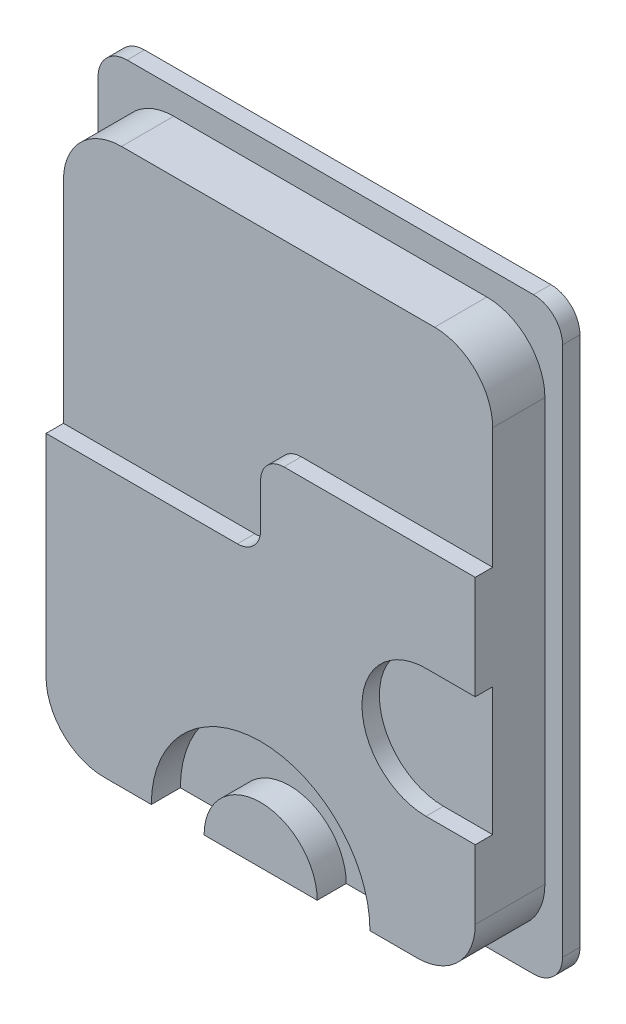
ISO-10303-21;
HEADER;
FILE_DESCRIPTION(('STEP AP214'),'2;1');
FILE_NAME('part.step','',(''),(''),'','','');
FILE_SCHEMA(('AUTOMOTIVE_DESIGN { 1 0 10303 214 1 1 1 1 }'));
ENDSEC;
DATA;
#1=APPLICATION_CONTEXT('core data for automotive mechanical design processes');
#2=APPLICATION_PROTOCOL_DEFINITION('international standard','automotive_design',2000,#1);
#3=PRODUCT_CONTEXT('',#1,'mechanical');
#4=PRODUCT('Part','Part','',(#3));
#5=PRODUCT_RELATED_PRODUCT_CATEGORY('part','',(#4));
#6=PRODUCT_DEFINITION_FORMATION('','',#4);
#7=PRODUCT_DEFINITION_CONTEXT('part definition',#1,'design');
#8=PRODUCT_DEFINITION('design','',#6,#7);
#9=PRODUCT_DEFINITION_SHAPE('','',#8);
#10=(LENGTH_UNIT() NAMED_UNIT(*) SI_UNIT(.MILLI.,.METRE.));
#11=(NAMED_UNIT(*) PLANE_ANGLE_UNIT() SI_UNIT($,.RADIAN.));
#12=(NAMED_UNIT(*) SI_UNIT($,.STERADIAN.) SOLID_ANGLE_UNIT());
#13=UNCERTAINTY_MEASURE_WITH_UNIT(LENGTH_MEASURE(1.E-05),#10,'distance_accuracy_value','');
#14=(GEOMETRIC_REPRESENTATION_CONTEXT(3) GLOBAL_UNCERTAINTY_ASSIGNED_CONTEXT((#13)) GLOBAL_UNIT_ASSIGNED_CONTEXT((#10,
#11,#12)) REPRESENTATION_CONTEXT('',''));
#15=CARTESIAN_POINT('',(0.,0.,0.));
#16=DIRECTION('',(0.,0.,1.));
#17=DIRECTION('',(1.,0.,0.));
#18=AXIS2_PLACEMENT_3D('',#15,#16,#17);
#19=CARTESIAN_POINT('',(5.,5.,15.));
#20=DIRECTION('',(0.,0.,-1.));
#21=DIRECTION('',(-1.,0.,0.));
#22=AXIS2_PLACEMENT_3D('',#19,#20,#21);
#23=PLANE('',#22);
#24=CARTESIAN_POINT('',(40.,4.37176263878269,15.));
#25=DIRECTION('',(0.,0.,1.));
#26=DIRECTION('',(1.,0.,0.));
#27=AXIS2_PLACEMENT_3D('',#24,#25,#26);
#28=CIRCLE('',#27,9.73943655351803);
#29=CARTESIAN_POINT('',(49.739436553518,4.37176263878269,15.));
#30=VERTEX_POINT('',#29);
#31=CARTESIAN_POINT('',(30.260563446482,4.37176263878269,15.));
#32=VERTEX_POINT('',#31);
#33=EDGE_CURVE('E235',#30,#32,#28,.T.);
#34=ORIENTED_EDGE('',*,*,#33,.T.);
#35=DIRECTION('',(1.,0.,0.));
#36=VECTOR('',#35,1.);
#37=CARTESIAN_POINT('',(13.0370379435771,4.37176263878269,15.));
#38=LINE('',#37,#36);
#39=EDGE_CURVE('E366',#32,#30,#38,.T.);
#40=ORIENTED_EDGE('',*,*,#39,.T.);
#41=EDGE_LOOP('',(#34,#40));
#42=FACE_BOUND('',#41,.T.);
#43=ADVANCED_FACE('F34',(#42),#23,.F.);
#44=CARTESIAN_POINT('',(5.,5.,15.));
#45=DIRECTION('',(0.,0.,-1.));
#46=DIRECTION('',(-1.,0.,0.));
#47=AXIS2_PLACEMENT_3D('',#44,#45,#46);
#48=CYLINDRICAL_SURFACE('',#47,5.);
#49=DIRECTION('',(0.,0.,-1.));
#50=VECTOR('',#49,1.);
#51=CARTESIAN_POINT('',(5.00000000000004,0.,15.));
#52=LINE('',#51,#50);
#53=CARTESIAN_POINT('',(5.00000000000004,0.,3.));
#54=VERTEX_POINT('',#53);
#55=CARTESIAN_POINT('',(5.00000000000004,0.,0.));
#56=VERTEX_POINT('',#55);
#57=EDGE_CURVE('E453',#54,#56,#52,.T.);
#58=ORIENTED_EDGE('',*,*,#57,.F.);
#59=CARTESIAN_POINT('',(5.,5.,3.));
#60=DIRECTION('',(0.,0.,-1.));
#61=DIRECTION('',(-1.,0.,0.));
#62=AXIS2_PLACEMENT_3D('',#59,#60,#61);
#63=CIRCLE('',#62,5.);
#64=CARTESIAN_POINT('',(0.,5.00000000000004,3.));
#65=VERTEX_POINT('',#64);
#66=EDGE_CURVE('E412',#54,#65,#63,.T.);
#67=ORIENTED_EDGE('',*,*,#66,.T.);
#68=DIRECTION('',(0.,0.,-1.));
#69=VECTOR('',#68,1.);
#70=CARTESIAN_POINT('',(0.,5.00000000000004,15.));
#71=LINE('',#70,#69);
#72=CARTESIAN_POINT('',(0.,5.00000000000004,0.));
#73=VERTEX_POINT('',#72);
#74=EDGE_CURVE('E439',#65,#73,#71,.T.);
#75=ORIENTED_EDGE('',*,*,#74,.T.);
#76=CARTESIAN_POINT('',(5.,5.,0.));
#77=DIRECTION('',(0.,0.,1.));
#78=DIRECTION('',(-1.,0.,0.));
#79=AXIS2_PLACEMENT_3D('',#76,#77,#78);
#80=CIRCLE('',#79,5.);
#81=EDGE_CURVE('E415',#73,#56,#80,.T.);
#82=ORIENTED_EDGE('',*,*,#81,.T.);
#83=EDGE_LOOP('',(#58,#67,#75,#82));
#84=FACE_BOUND('',#83,.T.);
#85=ADVANCED_FACE('F36',(#84),#48,.T.);
#86=CARTESIAN_POINT('',(5.00000000000004,0.,15.));
#87=DIRECTION('',(0.,1.,0.));
#88=DIRECTION('',(0.,0.,1.));
#89=AXIS2_PLACEMENT_3D('',#86,#87,#88);
#90=PLANE('',#89);
#91=DIRECTION('',(0.,0.,-1.));
#92=VECTOR('',#91,1.);
#93=CARTESIAN_POINT('',(75.,0.,15.));
#94=LINE('',#93,#92);
#95=CARTESIAN_POINT('',(75.,0.,3.));
#96=VERTEX_POINT('',#95);
#97=CARTESIAN_POINT('',(75.,0.,0.));
#98=VERTEX_POINT('',#97);
#99=EDGE_CURVE('E451',#96,#98,#94,.T.);
#100=ORIENTED_EDGE('',*,*,#99,.F.);
#101=DIRECTION('',(-1.,0.,0.));
#102=VECTOR('',#101,1.);
#103=CARTESIAN_POINT('',(5.00000000000004,0.,3.));
#104=LINE('',#103,#102);
#105=EDGE_CURVE('E409',#96,#54,#104,.T.);
#106=ORIENTED_EDGE('',*,*,#105,.T.);
#107=ORIENTED_EDGE('',*,*,#57,.T.);
#108=DIRECTION('',(1.,0.,0.));
#109=VECTOR('',#108,1.);
#110=CARTESIAN_POINT('',(5.00000000000004,0.,0.));
#111=LINE('',#110,#109);
#112=EDGE_CURVE('E418',#56,#98,#111,.T.);
#113=ORIENTED_EDGE('',*,*,#112,.T.);
#114=EDGE_LOOP('',(#100,#106,#107,#113));
#115=FACE_BOUND('',#114,.T.);
#116=ADVANCED_FACE('F554',(#115),#90,.F.);
#117=CARTESIAN_POINT('',(75.,5.,15.));
#118=DIRECTION('',(0.,0.,-1.));
#119=DIRECTION('',(-1.,0.,0.));
#120=AXIS2_PLACEMENT_3D('',#117,#118,#119);
#121=CYLINDRICAL_SURFACE('',#120,5.);
#122=DIRECTION('',(0.,0.,-1.));
#123=VECTOR('',#122,1.);
#124=CARTESIAN_POINT('',(80.,5.,15.));
#125=LINE('',#124,#123);
#126=CARTESIAN_POINT('',(80.,5.,3.));
#127=VERTEX_POINT('',#126);
#128=CARTESIAN_POINT('',(80.,5.,0.));
#129=VERTEX_POINT('',#128);
#130=EDGE_CURVE('E449',#127,#129,#125,.T.);
#131=ORIENTED_EDGE('',*,*,#130,.F.);
#132=CARTESIAN_POINT('',(75.,5.,3.));
#133=DIRECTION('',(0.,0.,-1.));
#134=DIRECTION('',(-1.,0.,0.));
#135=AXIS2_PLACEMENT_3D('',#132,#133,#134);
#136=CIRCLE('',#135,5.);
#137=EDGE_CURVE('E406',#127,#96,#136,.T.);
#138=ORIENTED_EDGE('',*,*,#137,.T.);
#139=ORIENTED_EDGE('',*,*,#99,.T.);
#140=CARTESIAN_POINT('',(75.,5.,0.));
#141=DIRECTION('',(0.,0.,1.));
#142=DIRECTION('',(1.,0.,0.));
#143=AXIS2_PLACEMENT_3D('',#140,#141,#142);
#144=CIRCLE('',#143,5.);
#145=EDGE_CURVE('E421',#98,#129,#144,.T.);
#146=ORIENTED_EDGE('',*,*,#145,.T.);
#147=EDGE_LOOP('',(#131,#138,#139,#146));
#148=FACE_BOUND('',#147,.T.);
#149=ADVANCED_FACE('F601',(#148),#121,.T.);
#150=CARTESIAN_POINT('',(80.,5.00000000000004,15.));
#151=DIRECTION('',(-1.,0.,0.));
#152=DIRECTION('',(0.,0.,1.));
#153=AXIS2_PLACEMENT_3D('',#150,#151,#152);
#154=PLANE('',#153);
#155=DIRECTION('',(0.,0.,-1.));
#156=VECTOR('',#155,1.);
#157=CARTESIAN_POINT('',(80.,96.346,15.));
#158=LINE('',#157,#156);
#159=CARTESIAN_POINT('',(80.,96.346,3.));
#160=VERTEX_POINT('',#159);
#161=CARTESIAN_POINT('',(80.,96.346,0.));
#162=VERTEX_POINT('',#161);
#163=EDGE_CURVE('E447',#160,#162,#158,.T.);
#164=ORIENTED_EDGE('',*,*,#163,.F.);
#165=DIRECTION('',(0.,-1.,0.));
#166=VECTOR('',#165,1.);
#167=CARTESIAN_POINT('',(80.,5.00000000000004,3.));
#168=LINE('',#167,#166);
#169=EDGE_CURVE('E403',#160,#127,#168,.T.);
#170=ORIENTED_EDGE('',*,*,#169,.T.);
#171=ORIENTED_EDGE('',*,*,#130,.T.);
#172=DIRECTION('',(0.,1.,0.));
#173=VECTOR('',#172,1.);
#174=CARTESIAN_POINT('',(80.,5.00000000000004,0.));
#175=LINE('',#174,#173);
#176=EDGE_CURVE('E424',#129,#162,#175,.T.);
#177=ORIENTED_EDGE('',*,*,#176,.T.);
#178=EDGE_LOOP('',(#164,#170,#171,#177));
#179=FACE_BOUND('',#178,.T.);
#180=ADVANCED_FACE('F597',(#179),#154,.F.);
#181=CARTESIAN_POINT('',(75.,96.346,15.));
#182=DIRECTION('',(0.,0.,-1.));
#183=DIRECTION('',(-1.,0.,0.));
#184=AXIS2_PLACEMENT_3D('',#181,#182,#183);
#185=CYLINDRICAL_SURFACE('',#184,5.);
#186=DIRECTION('',(0.,0.,-1.));
#187=VECTOR('',#186,1.);
#188=CARTESIAN_POINT('',(75.,101.346,15.));
#189=LINE('',#188,#187);
#190=CARTESIAN_POINT('',(75.,101.346,3.));
#191=VERTEX_POINT('',#190);
#192=CARTESIAN_POINT('',(75.,101.346,0.));
#193=VERTEX_POINT('',#192);
#194=EDGE_CURVE('E445',#191,#193,#189,.T.);
#195=ORIENTED_EDGE('',*,*,#194,.F.);
#196=CARTESIAN_POINT('',(75.,96.346,3.));
#197=DIRECTION('',(0.,0.,-1.));
#198=DIRECTION('',(-1.,0.,0.));
#199=AXIS2_PLACEMENT_3D('',#196,#197,#198);
#200=CIRCLE('',#199,5.);
#201=EDGE_CURVE('E400',#191,#160,#200,.T.);
#202=ORIENTED_EDGE('',*,*,#201,.T.);
#203=ORIENTED_EDGE('',*,*,#163,.T.);
#204=CARTESIAN_POINT('',(75.,96.346,0.));
#205=DIRECTION('',(0.,0.,1.));
#206=DIRECTION('',(-1.,0.,0.));
#207=AXIS2_PLACEMENT_3D('',#204,#205,#206);
#208=CIRCLE('',#207,5.);
#209=EDGE_CURVE('E427',#162,#193,#208,.T.);
#210=ORIENTED_EDGE('',*,*,#209,.T.);
#211=EDGE_LOOP('',(#195,#202,#203,#210));
#212=FACE_BOUND('',#211,.T.);
#213=ADVANCED_FACE('F593',(#212),#185,.T.);
#214=CARTESIAN_POINT('',(5.00000000000004,101.346,15.));
#215=DIRECTION('',(0.,-1.,0.));
#216=DIRECTION('',(0.,0.,-1.));
#217=AXIS2_PLACEMENT_3D('',#214,#215,#216);
#218=PLANE('',#217);
#219=DIRECTION('',(0.,0.,-1.));
#220=VECTOR('',#219,1.);
#221=CARTESIAN_POINT('',(5.00000000000004,101.346,15.));
#222=LINE('',#221,#220);
#223=CARTESIAN_POINT('',(5.00000000000004,101.346,3.));
#224=VERTEX_POINT('',#223);
#225=CARTESIAN_POINT('',(5.00000000000004,101.346,0.));
#226=VERTEX_POINT('',#225);
#227=EDGE_CURVE('E443',#224,#226,#222,.T.);
#228=ORIENTED_EDGE('',*,*,#227,.F.);
#229=DIRECTION('',(1.,0.,0.));
#230=VECTOR('',#229,1.);
#231=CARTESIAN_POINT('',(5.00000000000004,101.346,3.));
#232=LINE('',#231,#230);
#233=EDGE_CURVE('E397',#224,#191,#232,.T.);
#234=ORIENTED_EDGE('',*,*,#233,.T.);
#235=ORIENTED_EDGE('',*,*,#194,.T.);
#236=DIRECTION('',(-1.,0.,0.));
#237=VECTOR('',#236,1.);
#238=CARTESIAN_POINT('',(5.00000000000004,101.346,0.));
#239=LINE('',#238,#237);
#240=EDGE_CURVE('E430',#193,#226,#239,.T.);
#241=ORIENTED_EDGE('',*,*,#240,.T.);
#242=EDGE_LOOP('',(#228,#234,#235,#241));
#243=FACE_BOUND('',#242,.T.);
#244=ADVANCED_FACE('F589',(#243),#218,.F.);
#245=CARTESIAN_POINT('',(5.,96.346,15.));
#246=DIRECTION('',(0.,0.,-1.));
#247=DIRECTION('',(-1.,0.,0.));
#248=AXIS2_PLACEMENT_3D('',#245,#246,#247);
#249=CYLINDRICAL_SURFACE('',#248,5.);
#250=DIRECTION('',(0.,0.,-1.));
#251=VECTOR('',#250,1.);
#252=CARTESIAN_POINT('',(0.,96.346,15.));
#253=LINE('',#252,#251);
#254=CARTESIAN_POINT('',(0.,96.346,3.));
#255=VERTEX_POINT('',#254);
#256=CARTESIAN_POINT('',(0.,96.346,0.));
#257=VERTEX_POINT('',#256);
#258=EDGE_CURVE('E441',#255,#257,#253,.T.);
#259=ORIENTED_EDGE('',*,*,#258,.F.);
#260=CARTESIAN_POINT('',(5.,96.346,3.));
#261=DIRECTION('',(0.,0.,-1.));
#262=DIRECTION('',(-1.,0.,0.));
#263=AXIS2_PLACEMENT_3D('',#260,#261,#262);
#264=CIRCLE('',#263,5.);
#265=EDGE_CURVE('E377',#255,#224,#264,.T.);
#266=ORIENTED_EDGE('',*,*,#265,.T.);
#267=ORIENTED_EDGE('',*,*,#227,.T.);
#268=CARTESIAN_POINT('',(5.,96.346,0.));
#269=DIRECTION('',(0.,0.,1.));
#270=DIRECTION('',(-1.,0.,0.));
#271=AXIS2_PLACEMENT_3D('',#268,#269,#270);
#272=CIRCLE('',#271,5.);
#273=EDGE_CURVE('E433',#226,#257,#272,.T.);
#274=ORIENTED_EDGE('',*,*,#273,.T.);
#275=EDGE_LOOP('',(#259,#266,#267,#274));
#276=FACE_BOUND('',#275,.T.);
#277=ADVANCED_FACE('F582',(#276),#249,.T.);
#278=CARTESIAN_POINT('',(0.,5.00000000000004,15.));
#279=DIRECTION('',(1.,0.,0.));
#280=DIRECTION('',(0.,0.,-1.));
#281=AXIS2_PLACEMENT_3D('',#278,#279,#280);
#282=PLANE('',#281);
#283=ORIENTED_EDGE('',*,*,#74,.F.);
#284=DIRECTION('',(0.,1.,0.));
#285=VECTOR('',#284,1.);
#286=CARTESIAN_POINT('',(0.,5.00000000000004,3.));
#287=LINE('',#286,#285);
#288=EDGE_CURVE('E455',#65,#255,#287,.T.);
#289=ORIENTED_EDGE('',*,*,#288,.T.);
#290=ORIENTED_EDGE('',*,*,#258,.T.);
#291=DIRECTION('',(0.,-1.,0.));
#292=VECTOR('',#291,1.);
#293=CARTESIAN_POINT('',(0.,5.00000000000004,0.));
#294=LINE('',#293,#292);
#295=EDGE_CURVE('E436',#257,#73,#294,.T.);
#296=ORIENTED_EDGE('',*,*,#295,.T.);
#297=EDGE_LOOP('',(#283,#289,#290,#296));
#298=FACE_BOUND('',#297,.T.);
#299=ADVANCED_FACE('F577',(#298),#282,.F.);
#300=CARTESIAN_POINT('',(5.,5.,0.));
#301=DIRECTION('',(0.,0.,-1.));
#302=DIRECTION('',(-1.,0.,0.));
#303=AXIS2_PLACEMENT_3D('',#300,#301,#302);
#304=PLANE('',#303);
#305=ORIENTED_EDGE('',*,*,#81,.F.);
#306=ORIENTED_EDGE('',*,*,#295,.F.);
#307=ORIENTED_EDGE('',*,*,#273,.F.);
#308=ORIENTED_EDGE('',*,*,#240,.F.);
#309=ORIENTED_EDGE('',*,*,#209,.F.);
#310=ORIENTED_EDGE('',*,*,#176,.F.);
#311=ORIENTED_EDGE('',*,*,#145,.F.);
#312=ORIENTED_EDGE('',*,*,#112,.F.);
#313=EDGE_LOOP('',(#305,#306,#307,#308,#309,#310,#311,#312));
#314=FACE_BOUND('',#313,.T.);
#315=ADVANCED_FACE('F573',(#314),#304,.T.);
#316=CARTESIAN_POINT('',(0.,0.,3.));
#317=DIRECTION('',(0.,0.,-1.));
#318=DIRECTION('',(-1.,0.,0.));
#319=AXIS2_PLACEMENT_3D('',#316,#317,#318);
#320=PLANE('',#319);
#321=CARTESIAN_POINT('',(13.0370379435771,14.3717626387827,3.));
#322=DIRECTION('',(0.,0.,1.));
#323=DIRECTION('',(-1.,0.,0.));
#324=AXIS2_PLACEMENT_3D('',#321,#322,#323);
#325=CIRCLE('',#324,10.);
#326=CARTESIAN_POINT('',(3.03703794357706,14.3717626387827,3.));
#327=VERTEX_POINT('',#326);
#328=CARTESIAN_POINT('',(13.0370379435771,4.37176263878269,3.));
#329=VERTEX_POINT('',#328);
#330=EDGE_CURVE('E334',#327,#329,#325,.T.);
#331=ORIENTED_EDGE('',*,*,#330,.F.);
#332=DIRECTION('',(0.,-1.,0.));
#333=VECTOR('',#332,1.);
#334=CARTESIAN_POINT('',(3.03703794357706,14.3717626387827,3.));
#335=LINE('',#334,#333);
#336=CARTESIAN_POINT('',(3.03703794357706,86.9742373612173,3.));
#337=VERTEX_POINT('',#336);
#338=EDGE_CURVE('E356',#337,#327,#335,.T.);
#339=ORIENTED_EDGE('',*,*,#338,.F.);
#340=CARTESIAN_POINT('',(13.0370379435771,86.9742373612173,3.));
#341=DIRECTION('',(0.,0.,1.));
#342=DIRECTION('',(-1.,0.,0.));
#343=AXIS2_PLACEMENT_3D('',#340,#341,#342);
#344=CIRCLE('',#343,10.);
#345=CARTESIAN_POINT('',(13.0370379435771,96.9742373612173,3.));
#346=VERTEX_POINT('',#345);
#347=EDGE_CURVE('E353',#346,#337,#344,.T.);
#348=ORIENTED_EDGE('',*,*,#347,.F.);
#349=DIRECTION('',(-1.,0.,0.));
#350=VECTOR('',#349,1.);
#351=CARTESIAN_POINT('',(13.0370379435771,96.9742373612173,3.));
#352=LINE('',#351,#350);
#353=CARTESIAN_POINT('',(66.962962056423,96.9742373612173,3.));
#354=VERTEX_POINT('',#353);
#355=EDGE_CURVE('E350',#354,#346,#352,.T.);
#356=ORIENTED_EDGE('',*,*,#355,.F.);
#357=CARTESIAN_POINT('',(66.962962056423,86.9742373612173,3.));
#358=DIRECTION('',(0.,0.,1.));
#359=DIRECTION('',(-1.,0.,0.));
#360=AXIS2_PLACEMENT_3D('',#357,#358,#359);
#361=CIRCLE('',#360,9.99999999999999);
#362=CARTESIAN_POINT('',(76.962962056423,86.9742373612173,3.));
#363=VERTEX_POINT('',#362);
#364=EDGE_CURVE('E347',#363,#354,#361,.T.);
#365=ORIENTED_EDGE('',*,*,#364,.F.);
#366=DIRECTION('',(0.,1.,0.));
#367=VECTOR('',#366,1.);
#368=CARTESIAN_POINT('',(76.962962056423,14.3717626387827,3.));
#369=LINE('',#368,#367);
#370=CARTESIAN_POINT('',(76.962962056423,14.3717626387827,3.));
#371=VERTEX_POINT('',#370);
#372=EDGE_CURVE('E344',#371,#363,#369,.T.);
#373=ORIENTED_EDGE('',*,*,#372,.F.);
#374=CARTESIAN_POINT('',(66.962962056423,14.3717626387827,3.));
#375=DIRECTION('',(0.,0.,1.));
#376=DIRECTION('',(1.,0.,0.));
#377=AXIS2_PLACEMENT_3D('',#374,#375,#376);
#378=CIRCLE('',#377,10.);
#379=CARTESIAN_POINT('',(66.962962056423,4.37176263878269,3.));
#380=VERTEX_POINT('',#379);
#381=EDGE_CURVE('E341',#380,#371,#378,.T.);
#382=ORIENTED_EDGE('',*,*,#381,.F.);
#383=DIRECTION('',(1.,0.,0.));
#384=VECTOR('',#383,1.);
#385=CARTESIAN_POINT('',(13.0370379435771,4.37176263878269,3.));
#386=LINE('',#385,#384);
#387=EDGE_CURVE('E337',#329,#380,#386,.T.);
#388=ORIENTED_EDGE('',*,*,#387,.F.);
#389=EDGE_LOOP('',(#331,#339,#348,#356,#365,#373,#382,#388));
#390=FACE_BOUND('',#389,.T.);
#391=ORIENTED_EDGE('',*,*,#105,.F.);
#392=ORIENTED_EDGE('',*,*,#137,.F.);
#393=ORIENTED_EDGE('',*,*,#169,.F.);
#394=ORIENTED_EDGE('',*,*,#201,.F.);
#395=ORIENTED_EDGE('',*,*,#233,.F.);
#396=ORIENTED_EDGE('',*,*,#265,.F.);
#397=ORIENTED_EDGE('',*,*,#288,.F.);
#398=ORIENTED_EDGE('',*,*,#66,.F.);
#399=EDGE_LOOP('',(#391,#392,#393,#394,#395,#396,#397,#398));
#400=FACE_BOUND('',#399,.T.);
#401=ADVANCED_FACE('F481',(#390,#400),#320,.F.);
#402=CARTESIAN_POINT('',(13.0370379435771,14.3717626387827,3.));
#403=DIRECTION('',(0.,0.,1.));
#404=DIRECTION('',(1.,0.,0.));
#405=AXIS2_PLACEMENT_3D('',#402,#403,#404);
#406=CYLINDRICAL_SURFACE('',#405,10.);
#407=CARTESIAN_POINT('',(13.0370379435771,14.3717626387827,15.));
#408=DIRECTION('',(0.,0.,1.));
#409=DIRECTION('',(-1.,0.,0.));
#410=AXIS2_PLACEMENT_3D('',#407,#408,#409);
#411=CIRCLE('',#410,10.);
#412=CARTESIAN_POINT('',(3.03703794357706,14.3717626387827,15.));
#413=VERTEX_POINT('',#412);
#414=CARTESIAN_POINT('',(13.0370379435771,4.37176263878269,15.));
#415=VERTEX_POINT('',#414);
#416=EDGE_CURVE('E333',#413,#415,#411,.T.);
#417=ORIENTED_EDGE('',*,*,#416,.F.);
#418=DIRECTION('',(0.,0.,1.));
#419=VECTOR('',#418,1.);
#420=CARTESIAN_POINT('',(3.03703794357706,14.3717626387827,3.));
#421=LINE('',#420,#419);
#422=EDGE_CURVE('E374',#327,#413,#421,.T.);
#423=ORIENTED_EDGE('',*,*,#422,.F.);
#424=ORIENTED_EDGE('',*,*,#330,.T.);
#425=DIRECTION('',(0.,0.,1.));
#426=VECTOR('',#425,1.);
#427=CARTESIAN_POINT('',(13.0370379435771,4.37176263878269,3.));
#428=LINE('',#427,#426);
#429=EDGE_CURVE('E359',#329,#415,#428,.T.);
#430=ORIENTED_EDGE('',*,*,#429,.T.);
#431=EDGE_LOOP('',(#417,#423,#424,#430));
#432=FACE_BOUND('',#431,.T.);
#433=ADVANCED_FACE('F487',(#432),#406,.T.);
#434=CARTESIAN_POINT('',(3.03703794357706,14.3717626387827,3.));
#435=DIRECTION('',(-1.,0.,0.));
#436=DIRECTION('',(0.,0.,1.));
#437=AXIS2_PLACEMENT_3D('',#434,#435,#436);
#438=PLANE('',#437);
#439=DIRECTION('',(0.,0.,1.));
#440=VECTOR('',#439,1.);
#441=CARTESIAN_POINT('',(3.03703794357705,50.673,12.));
#442=LINE('',#441,#440);
#443=CARTESIAN_POINT('',(3.03703794357705,50.673,12.));
#444=VERTEX_POINT('',#443);
#445=CARTESIAN_POINT('',(3.03703794357706,50.673,15.));
#446=VERTEX_POINT('',#445);
#447=EDGE_CURVE('E301',#444,#446,#442,.T.);
#448=ORIENTED_EDGE('',*,*,#447,.F.);
#449=DIRECTION('',(0.,-1.,0.));
#450=VECTOR('',#449,1.);
#451=CARTESIAN_POINT('',(3.03703794357705,50.673,12.));
#452=LINE('',#451,#450);
#453=CARTESIAN_POINT('',(3.03703794357705,86.9742373612173,12.));
#454=VERTEX_POINT('',#453);
#455=EDGE_CURVE('E281',#454,#444,#452,.T.);
#456=ORIENTED_EDGE('',*,*,#455,.F.);
#457=DIRECTION('',(0.,0.,1.));
#458=VECTOR('',#457,1.);
#459=CARTESIAN_POINT('',(3.03703794357706,86.9742373612173,3.));
#460=LINE('',#459,#458);
#461=EDGE_CURVE('E378',#337,#454,#460,.T.);
#462=ORIENTED_EDGE('',*,*,#461,.F.);
#463=ORIENTED_EDGE('',*,*,#338,.T.);
#464=ORIENTED_EDGE('',*,*,#422,.T.);
#465=DIRECTION('',(0.,-1.,0.));
#466=VECTOR('',#465,1.);
#467=CARTESIAN_POINT('',(3.03703794357706,14.3717626387827,15.));
#468=LINE('',#467,#466);
#469=EDGE_CURVE('E338',#446,#413,#468,.T.);
#470=ORIENTED_EDGE('',*,*,#469,.F.);
#471=EDGE_LOOP('',(#448,#456,#462,#463,#464,#470));
#472=FACE_BOUND('',#471,.T.);
#473=ADVANCED_FACE('F491',(#472),#438,.T.);
#474=CARTESIAN_POINT('',(13.0370379435771,86.9742373612173,3.));
#475=DIRECTION('',(0.,0.,1.));
#476=DIRECTION('',(1.,0.,0.));
#477=AXIS2_PLACEMENT_3D('',#474,#475,#476);
#478=CYLINDRICAL_SURFACE('',#477,10.);
#479=CARTESIAN_POINT('',(13.0370379435771,86.9742373612173,12.));
#480=DIRECTION('',(0.,0.,-1.));
#481=DIRECTION('',(-1.,0.,0.));
#482=AXIS2_PLACEMENT_3D('',#479,#480,#481);
#483=CIRCLE('',#482,10.);
#484=CARTESIAN_POINT('',(13.0370379435771,96.9742373612173,12.));
#485=VERTEX_POINT('',#484);
#486=EDGE_CURVE('E331',#485,#454,#483,.F.);
#487=ORIENTED_EDGE('',*,*,#486,.F.);
#488=DIRECTION('',(0.,0.,1.));
#489=VECTOR('',#488,1.);
#490=CARTESIAN_POINT('',(13.0370379435771,96.9742373612173,3.));
#491=LINE('',#490,#489);
#492=EDGE_CURVE('E381',#346,#485,#491,.T.);
#493=ORIENTED_EDGE('',*,*,#492,.F.);
#494=ORIENTED_EDGE('',*,*,#347,.T.);
#495=ORIENTED_EDGE('',*,*,#461,.T.);
#496=EDGE_LOOP('',(#487,#493,#494,#495));
#497=FACE_BOUND('',#496,.T.);
#498=ADVANCED_FACE('F497',(#497),#478,.T.);
#499=CARTESIAN_POINT('',(13.0370379435771,96.9742373612173,3.));
#500=DIRECTION('',(0.,1.,0.));
#501=DIRECTION('',(0.,0.,1.));
#502=AXIS2_PLACEMENT_3D('',#499,#500,#501);
#503=PLANE('',#502);
#504=DIRECTION('',(-1.,0.,0.));
#505=VECTOR('',#504,1.);
#506=CARTESIAN_POINT('',(13.0370379435771,96.9742373612173,12.));
#507=LINE('',#506,#505);
#508=CARTESIAN_POINT('',(66.962962056423,96.9742373612173,12.));
#509=VERTEX_POINT('',#508);
#510=EDGE_CURVE('E329',#509,#485,#507,.T.);
#511=ORIENTED_EDGE('',*,*,#510,.F.);
#512=DIRECTION('',(0.,0.,1.));
#513=VECTOR('',#512,1.);
#514=CARTESIAN_POINT('',(66.962962056423,96.9742373612173,3.));
#515=LINE('',#514,#513);
#516=EDGE_CURVE('E384',#354,#509,#515,.T.);
#517=ORIENTED_EDGE('',*,*,#516,.F.);
#518=ORIENTED_EDGE('',*,*,#355,.T.);
#519=ORIENTED_EDGE('',*,*,#492,.T.);
#520=EDGE_LOOP('',(#511,#517,#518,#519));
#521=FACE_BOUND('',#520,.T.);
#522=ADVANCED_FACE('F500',(#521),#503,.T.);
#523=CARTESIAN_POINT('',(66.962962056423,86.9742373612173,3.));
#524=DIRECTION('',(0.,0.,1.));
#525=DIRECTION('',(1.,0.,0.));
#526=AXIS2_PLACEMENT_3D('',#523,#524,#525);
#527=CYLINDRICAL_SURFACE('',#526,9.99999999999999);
#528=CARTESIAN_POINT('',(66.962962056423,86.9742373612173,12.));
#529=DIRECTION('',(0.,0.,-1.));
#530=DIRECTION('',(-1.,0.,0.));
#531=AXIS2_PLACEMENT_3D('',#528,#529,#530);
#532=CIRCLE('',#531,9.99999999999999);
#533=CARTESIAN_POINT('',(76.962962056423,86.9742373612173,12.));
#534=VERTEX_POINT('',#533);
#535=EDGE_CURVE('E318',#534,#509,#532,.F.);
#536=ORIENTED_EDGE('',*,*,#535,.F.);
#537=DIRECTION('',(0.,0.,1.));
#538=VECTOR('',#537,1.);
#539=CARTESIAN_POINT('',(76.962962056423,86.9742373612173,3.));
#540=LINE('',#539,#538);
#541=EDGE_CURVE('E387',#363,#534,#540,.T.);
#542=ORIENTED_EDGE('',*,*,#541,.F.);
#543=ORIENTED_EDGE('',*,*,#364,.T.);
#544=ORIENTED_EDGE('',*,*,#516,.T.);
#545=EDGE_LOOP('',(#536,#542,#543,#544));
#546=FACE_BOUND('',#545,.T.);
#547=ADVANCED_FACE('F504',(#546),#527,.T.);
#548=CARTESIAN_POINT('',(76.962962056423,14.3717626387827,3.));
#549=DIRECTION('',(1.,0.,0.));
#550=DIRECTION('',(0.,0.,-1.));
#551=AXIS2_PLACEMENT_3D('',#548,#549,#550);
#552=PLANE('',#551);
#553=DIRECTION('',(0.,0.,-1.));
#554=VECTOR('',#553,1.);
#555=CARTESIAN_POINT('',(76.962962056423,26.2747445421578,3.));
#556=LINE('',#555,#554);
#557=CARTESIAN_POINT('',(76.962962056423,26.2747445421578,15.));
#558=VERTEX_POINT('',#557);
#559=CARTESIAN_POINT('',(76.962962056423,26.2747445421578,12.));
#560=VERTEX_POINT('',#559);
#561=EDGE_CURVE('E278',#558,#560,#556,.T.);
#562=ORIENTED_EDGE('',*,*,#561,.F.);
#563=DIRECTION('',(0.,1.,0.));
#564=VECTOR('',#563,1.);
#565=CARTESIAN_POINT('',(76.962962056423,14.3717626387827,15.));
#566=LINE('',#565,#564);
#567=CARTESIAN_POINT('',(76.962962056423,14.3717626387827,15.));
#568=VERTEX_POINT('',#567);
#569=EDGE_CURVE('E370',#568,#558,#566,.T.);
#570=ORIENTED_EDGE('',*,*,#569,.F.);
#571=DIRECTION('',(0.,0.,1.));
#572=VECTOR('',#571,1.);
#573=CARTESIAN_POINT('',(76.962962056423,14.3717626387827,3.));
#574=LINE('',#573,#572);
#575=EDGE_CURVE('E390',#371,#568,#574,.T.);
#576=ORIENTED_EDGE('',*,*,#575,.F.);
#577=ORIENTED_EDGE('',*,*,#372,.T.);
#578=ORIENTED_EDGE('',*,*,#541,.T.);
#579=DIRECTION('',(0.,1.,0.));
#580=VECTOR('',#579,1.);
#581=CARTESIAN_POINT('',(76.962962056423,113.135232520472,12.));
#582=LINE('',#581,#580);
#583=CARTESIAN_POINT('',(76.962962056423,66.1590874842606,12.));
#584=VERTEX_POINT('',#583);
#585=EDGE_CURVE('E299',#584,#534,#582,.T.);
#586=ORIENTED_EDGE('',*,*,#585,.F.);
#587=DIRECTION('',(0.,0.,1.));
#588=VECTOR('',#587,1.);
#589=CARTESIAN_POINT('',(76.962962056423,66.1590874842606,12.));
#590=LINE('',#589,#588);
#591=CARTESIAN_POINT('',(76.962962056423,66.1590874842606,15.));
#592=VERTEX_POINT('',#591);
#593=EDGE_CURVE('E315',#584,#592,#590,.T.);
#594=ORIENTED_EDGE('',*,*,#593,.T.);
#595=CARTESIAN_POINT('',(76.962962056423,48.3358576411929,15.));
#596=VERTEX_POINT('',#595);
#597=EDGE_CURVE('E369',#596,#592,#566,.T.);
#598=ORIENTED_EDGE('',*,*,#597,.F.);
#599=DIRECTION('',(0.,0.,1.));
#600=VECTOR('',#599,1.);
#601=CARTESIAN_POINT('',(76.962962056423,48.3358576411929,3.));
#602=LINE('',#601,#600);
#603=CARTESIAN_POINT('',(76.962962056423,48.3358576411929,12.));
#604=VERTEX_POINT('',#603);
#605=EDGE_CURVE('E57',#604,#596,#602,.T.);
#606=ORIENTED_EDGE('',*,*,#605,.F.);
#607=DIRECTION('',(0.,-1.,0.));
#608=VECTOR('',#607,1.);
#609=CARTESIAN_POINT('',(76.962962056423,14.3717626387827,12.));
#610=LINE('',#609,#608);
#611=EDGE_CURVE('E459',#604,#560,#610,.T.);
#612=ORIENTED_EDGE('',*,*,#611,.T.);
#613=EDGE_LOOP('',(#562,#570,#576,#577,#578,#586,#594,#598,#606,#612));
#614=FACE_BOUND('',#613,.T.);
#615=ADVANCED_FACE('F506',(#614),#552,.T.);
#616=CARTESIAN_POINT('',(66.962962056423,14.3717626387827,3.));
#617=DIRECTION('',(0.,0.,1.));
#618=DIRECTION('',(1.,0.,0.));
#619=AXIS2_PLACEMENT_3D('',#616,#617,#618);
#620=CYLINDRICAL_SURFACE('',#619,10.);
#621=CARTESIAN_POINT('',(66.962962056423,14.3717626387827,15.));
#622=DIRECTION('',(0.,0.,1.));
#623=DIRECTION('',(1.,0.,0.));
#624=AXIS2_PLACEMENT_3D('',#621,#622,#623);
#625=CIRCLE('',#624,10.);
#626=CARTESIAN_POINT('',(66.962962056423,4.37176263878269,15.));
#627=VERTEX_POINT('',#626);
#628=EDGE_CURVE('E365',#627,#568,#625,.T.);
#629=ORIENTED_EDGE('',*,*,#628,.F.);
#630=DIRECTION('',(0.,0.,1.));
#631=VECTOR('',#630,1.);
#632=CARTESIAN_POINT('',(66.962962056423,4.37176263878269,3.));
#633=LINE('',#632,#631);
#634=EDGE_CURVE('E392',#380,#627,#633,.T.);
#635=ORIENTED_EDGE('',*,*,#634,.F.);
#636=ORIENTED_EDGE('',*,*,#381,.T.);
#637=ORIENTED_EDGE('',*,*,#575,.T.);
#638=EDGE_LOOP('',(#629,#635,#636,#637));
#639=FACE_BOUND('',#638,.T.);
#640=ADVANCED_FACE('F476',(#639),#620,.T.);
#641=CARTESIAN_POINT('',(13.0370379435771,4.37176263878269,3.));
#642=DIRECTION('',(0.,-1.,0.));
#643=DIRECTION('',(0.,0.,-1.));
#644=AXIS2_PLACEMENT_3D('',#641,#642,#643);
#645=PLANE('',#644);
#646=DIRECTION('',(0.,0.,1.));
#647=VECTOR('',#646,1.);
#648=CARTESIAN_POINT('',(58.8280588282922,4.37176263878269,10.));
#649=LINE('',#648,#647);
#650=CARTESIAN_POINT('',(58.8280588282922,4.37176263878269,10.));
#651=VERTEX_POINT('',#650);
#652=CARTESIAN_POINT('',(58.8280588282922,4.37176263878269,15.));
#653=VERTEX_POINT('',#652);
#654=EDGE_CURVE('E251',#651,#653,#649,.T.);
#655=ORIENTED_EDGE('',*,*,#654,.F.);
#656=DIRECTION('',(-1.,0.,0.));
#657=VECTOR('',#656,1.);
#658=CARTESIAN_POINT('',(13.0370379435771,4.37176263878269,10.));
#659=LINE('',#658,#657);
#660=CARTESIAN_POINT('',(49.739436553518,4.37176263878269,10.));
#661=VERTEX_POINT('',#660);
#662=EDGE_CURVE('E11',#651,#661,#659,.T.);
#663=ORIENTED_EDGE('',*,*,#662,.T.);
#664=DIRECTION('',(0.,0.,1.));
#665=VECTOR('',#664,1.);
#666=CARTESIAN_POINT('',(49.739436553518,4.37176263878269,10.));
#667=LINE('',#666,#665);
#668=EDGE_CURVE('E231',#661,#30,#667,.T.);
#669=ORIENTED_EDGE('',*,*,#668,.T.);
#670=ORIENTED_EDGE('',*,*,#39,.F.);
#671=DIRECTION('',(0.,0.,1.));
#672=VECTOR('',#671,1.);
#673=CARTESIAN_POINT('',(30.260563446482,4.37176263878269,10.));
#674=LINE('',#673,#672);
#675=CARTESIAN_POINT('',(30.260563446482,4.37176263878269,10.));
#676=VERTEX_POINT('',#675);
#677=EDGE_CURVE('E49',#32,#676,#674,.F.);
#678=ORIENTED_EDGE('',*,*,#677,.T.);
#679=CARTESIAN_POINT('',(21.1719411717078,4.37176263878269,10.));
#680=VERTEX_POINT('',#679);
#681=EDGE_CURVE('E38',#676,#680,#659,.T.);
#682=ORIENTED_EDGE('',*,*,#681,.T.);
#683=DIRECTION('',(0.,0.,1.));
#684=VECTOR('',#683,1.);
#685=CARTESIAN_POINT('',(21.1719411717078,4.37176263878269,10.));
#686=LINE('',#685,#684);
#687=CARTESIAN_POINT('',(21.1719411717078,4.37176263878269,15.));
#688=VERTEX_POINT('',#687);
#689=EDGE_CURVE('E239',#688,#680,#686,.F.);
#690=ORIENTED_EDGE('',*,*,#689,.F.);
#691=EDGE_CURVE('E362',#415,#688,#38,.T.);
#692=ORIENTED_EDGE('',*,*,#691,.F.);
#693=ORIENTED_EDGE('',*,*,#429,.F.);
#694=ORIENTED_EDGE('',*,*,#387,.T.);
#695=ORIENTED_EDGE('',*,*,#634,.T.);
#696=EDGE_CURVE('E253',#653,#627,#38,.T.);
#697=ORIENTED_EDGE('',*,*,#696,.F.);
#698=EDGE_LOOP('',(#655,#663,#669,#670,#678,#682,#690,#692,#693,#694,#695,#697));
#699=FACE_BOUND('',#698,.T.);
#700=ADVANCED_FACE('F249',(#699),#645,.T.);
#701=ORIENTED_EDGE('',*,*,#691,.T.);
#702=CARTESIAN_POINT('',(40.,4.37176263878269,15.));
#703=DIRECTION('',(0.,0.,1.));
#704=DIRECTION('',(1.,0.,0.));
#705=AXIS2_PLACEMENT_3D('',#702,#703,#704);
#706=CIRCLE('',#705,18.8280588282922);
#707=EDGE_CURVE('E246',#653,#688,#706,.T.);
#708=ORIENTED_EDGE('',*,*,#707,.F.);
#709=ORIENTED_EDGE('',*,*,#696,.T.);
#710=ORIENTED_EDGE('',*,*,#628,.T.);
#711=ORIENTED_EDGE('',*,*,#569,.T.);
#712=DIRECTION('',(1.,0.,0.));
#713=VECTOR('',#712,1.);
#714=CARTESIAN_POINT('',(83.7106382671181,26.2747445421578,15.));
#715=LINE('',#714,#713);
#716=CARTESIAN_POINT('',(68.4818848218886,26.2747445421578,15.));
#717=VERTEX_POINT('',#716);
#718=EDGE_CURVE('E259',#717,#558,#715,.T.);
#719=ORIENTED_EDGE('',*,*,#718,.F.);
#720=CARTESIAN_POINT('',(68.4818848218886,37.3053010916754,15.));
#721=DIRECTION('',(0.,0.,1.));
#722=DIRECTION('',(1.,0.,0.));
#723=AXIS2_PLACEMENT_3D('',#720,#721,#722);
#724=CIRCLE('',#723,11.0305565495176);
#725=CARTESIAN_POINT('',(68.4818848218886,48.3358576411929,15.));
#726=VERTEX_POINT('',#725);
#727=EDGE_CURVE('E256',#726,#717,#724,.T.);
#728=ORIENTED_EDGE('',*,*,#727,.F.);
#729=DIRECTION('',(1.,0.,0.));
#730=VECTOR('',#729,1.);
#731=CARTESIAN_POINT('',(5.,48.3358576411929,15.));
#732=LINE('',#731,#730);
#733=EDGE_CURVE('E458',#726,#596,#732,.T.);
#734=ORIENTED_EDGE('',*,*,#733,.T.);
#735=ORIENTED_EDGE('',*,*,#597,.T.);
#736=DIRECTION('',(1.,0.,0.));
#737=VECTOR('',#736,1.);
#738=CARTESIAN_POINT('',(44.,66.1590874842606,15.));
#739=LINE('',#738,#737);
#740=CARTESIAN_POINT('',(44.,66.1590874842606,15.));
#741=VERTEX_POINT('',#740);
#742=EDGE_CURVE('E284',#741,#592,#739,.T.);
#743=ORIENTED_EDGE('',*,*,#742,.F.);
#744=CARTESIAN_POINT('',(44.,62.1590874842606,15.));
#745=DIRECTION('',(0.,0.,-1.));
#746=DIRECTION('',(-1.,0.,0.));
#747=AXIS2_PLACEMENT_3D('',#744,#745,#746);
#748=CIRCLE('',#747,4.);
#749=CARTESIAN_POINT('',(40.,62.1590874842606,15.));
#750=VERTEX_POINT('',#749);
#751=EDGE_CURVE('E310',#750,#741,#748,.T.);
#752=ORIENTED_EDGE('',*,*,#751,.F.);
#753=DIRECTION('',(0.,1.,0.));
#754=VECTOR('',#753,1.);
#755=CARTESIAN_POINT('',(40.,54.673,15.));
#756=LINE('',#755,#754);
#757=CARTESIAN_POINT('',(40.,54.673,15.));
#758=VERTEX_POINT('',#757);
#759=EDGE_CURVE('E307',#758,#750,#756,.T.);
#760=ORIENTED_EDGE('',*,*,#759,.F.);
#761=CARTESIAN_POINT('',(36.,54.673,15.));
#762=DIRECTION('',(0.,0.,1.));
#763=DIRECTION('',(1.,0.,0.));
#764=AXIS2_PLACEMENT_3D('',#761,#762,#763);
#765=CIRCLE('',#764,4.);
#766=CARTESIAN_POINT('',(36.,50.673,15.));
#767=VERTEX_POINT('',#766);
#768=EDGE_CURVE('E304',#767,#758,#765,.T.);
#769=ORIENTED_EDGE('',*,*,#768,.F.);
#770=DIRECTION('',(1.,0.,0.));
#771=VECTOR('',#770,1.);
#772=CARTESIAN_POINT('',(36.,50.673,15.));
#773=LINE('',#772,#771);
#774=EDGE_CURVE('E280',#446,#767,#773,.T.);
#775=ORIENTED_EDGE('',*,*,#774,.F.);
#776=ORIENTED_EDGE('',*,*,#469,.T.);
#777=ORIENTED_EDGE('',*,*,#416,.T.);
#778=EDGE_LOOP('',(#701,#708,#709,#710,#711,#719,#728,#734,#735,#743,#752,#760,#769,#775,#776,#777));
#779=FACE_BOUND('',#778,.T.);
#780=ADVANCED_FACE('F473',(#779),#23,.F.);
#781=CARTESIAN_POINT('',(44.,66.1590874842606,12.));
#782=DIRECTION('',(0.,-1.,0.));
#783=DIRECTION('',(0.,0.,-1.));
#784=AXIS2_PLACEMENT_3D('',#781,#782,#783);
#785=PLANE('',#784);
#786=ORIENTED_EDGE('',*,*,#742,.T.);
#787=ORIENTED_EDGE('',*,*,#593,.F.);
#788=DIRECTION('',(1.,0.,0.));
#789=VECTOR('',#788,1.);
#790=CARTESIAN_POINT('',(44.,66.1590874842606,12.));
#791=LINE('',#790,#789);
#792=CARTESIAN_POINT('',(44.,66.1590874842606,12.));
#793=VERTEX_POINT('',#792);
#794=EDGE_CURVE('E296',#793,#584,#791,.T.);
#795=ORIENTED_EDGE('',*,*,#794,.F.);
#796=DIRECTION('',(0.,0.,1.));
#797=VECTOR('',#796,1.);
#798=CARTESIAN_POINT('',(44.,66.1590874842606,12.));
#799=LINE('',#798,#797);
#800=EDGE_CURVE('E319',#793,#741,#799,.T.);
#801=ORIENTED_EDGE('',*,*,#800,.T.);
#802=EDGE_LOOP('',(#786,#787,#795,#801));
#803=FACE_BOUND('',#802,.T.);
#804=ADVANCED_FACE('F521',(#803),#785,.F.);
#805=CARTESIAN_POINT('',(44.,62.1590874842606,12.));
#806=DIRECTION('',(0.,0.,1.));
#807=DIRECTION('',(1.,0.,0.));
#808=AXIS2_PLACEMENT_3D('',#805,#806,#807);
#809=CYLINDRICAL_SURFACE('',#808,4.);
#810=ORIENTED_EDGE('',*,*,#751,.T.);
#811=ORIENTED_EDGE('',*,*,#800,.F.);
#812=CARTESIAN_POINT('',(44.,62.1590874842606,12.));
#813=DIRECTION('',(0.,0.,-1.));
#814=DIRECTION('',(-1.,0.,0.));
#815=AXIS2_PLACEMENT_3D('',#812,#813,#814);
#816=CIRCLE('',#815,4.);
#817=CARTESIAN_POINT('',(40.,62.1590874842606,12.));
#818=VERTEX_POINT('',#817);
#819=EDGE_CURVE('E293',#818,#793,#816,.T.);
#820=ORIENTED_EDGE('',*,*,#819,.F.);
#821=DIRECTION('',(0.,0.,1.));
#822=VECTOR('',#821,1.);
#823=CARTESIAN_POINT('',(40.,62.1590874842606,12.));
#824=LINE('',#823,#822);
#825=EDGE_CURVE('E321',#818,#750,#824,.T.);
#826=ORIENTED_EDGE('',*,*,#825,.T.);
#827=EDGE_LOOP('',(#810,#811,#820,#826));
#828=FACE_BOUND('',#827,.T.);
#829=ADVANCED_FACE('F527',(#828),#809,.T.);
#830=CARTESIAN_POINT('',(40.,54.673,12.));
#831=DIRECTION('',(1.,0.,0.));
#832=DIRECTION('',(0.,0.,-1.));
#833=AXIS2_PLACEMENT_3D('',#830,#831,#832);
#834=PLANE('',#833);
#835=ORIENTED_EDGE('',*,*,#759,.T.);
#836=ORIENTED_EDGE('',*,*,#825,.F.);
#837=DIRECTION('',(0.,1.,0.));
#838=VECTOR('',#837,1.);
#839=CARTESIAN_POINT('',(40.,54.673,12.));
#840=LINE('',#839,#838);
#841=CARTESIAN_POINT('',(40.,54.673,12.));
#842=VERTEX_POINT('',#841);
#843=EDGE_CURVE('E290',#842,#818,#840,.T.);
#844=ORIENTED_EDGE('',*,*,#843,.F.);
#845=DIRECTION('',(0.,0.,1.));
#846=VECTOR('',#845,1.);
#847=CARTESIAN_POINT('',(40.,54.673,12.));
#848=LINE('',#847,#846);
#849=EDGE_CURVE('E323',#842,#758,#848,.T.);
#850=ORIENTED_EDGE('',*,*,#849,.T.);
#851=EDGE_LOOP('',(#835,#836,#844,#850));
#852=FACE_BOUND('',#851,.T.);
#853=ADVANCED_FACE('F533',(#852),#834,.F.);
#854=CARTESIAN_POINT('',(36.,54.673,12.));
#855=DIRECTION('',(0.,0.,1.));
#856=DIRECTION('',(1.,0.,0.));
#857=AXIS2_PLACEMENT_3D('',#854,#855,#856);
#858=CYLINDRICAL_SURFACE('',#857,4.);
#859=ORIENTED_EDGE('',*,*,#768,.T.);
#860=ORIENTED_EDGE('',*,*,#849,.F.);
#861=CARTESIAN_POINT('',(36.,54.673,12.));
#862=DIRECTION('',(0.,0.,1.));
#863=DIRECTION('',(1.,0.,0.));
#864=AXIS2_PLACEMENT_3D('',#861,#862,#863);
#865=CIRCLE('',#864,4.);
#866=CARTESIAN_POINT('',(36.,50.673,12.));
#867=VERTEX_POINT('',#866);
#868=EDGE_CURVE('E287',#867,#842,#865,.T.);
#869=ORIENTED_EDGE('',*,*,#868,.F.);
#870=DIRECTION('',(0.,0.,1.));
#871=VECTOR('',#870,1.);
#872=CARTESIAN_POINT('',(36.,50.673,12.));
#873=LINE('',#872,#871);
#874=EDGE_CURVE('E325',#867,#767,#873,.T.);
#875=ORIENTED_EDGE('',*,*,#874,.T.);
#876=EDGE_LOOP('',(#859,#860,#869,#875));
#877=FACE_BOUND('',#876,.T.);
#878=ADVANCED_FACE('F536',(#877),#858,.F.);
#879=CARTESIAN_POINT('',(36.,50.673,12.));
#880=DIRECTION('',(0.,-1.,0.));
#881=DIRECTION('',(1.,0.,0.));
#882=AXIS2_PLACEMENT_3D('',#879,#880,#881);
#883=PLANE('',#882);
#884=ORIENTED_EDGE('',*,*,#774,.T.);
#885=ORIENTED_EDGE('',*,*,#874,.F.);
#886=DIRECTION('',(1.,0.,0.));
#887=VECTOR('',#886,1.);
#888=CARTESIAN_POINT('',(36.,50.673,12.));
#889=LINE('',#888,#887);
#890=EDGE_CURVE('E283',#444,#867,#889,.T.);
#891=ORIENTED_EDGE('',*,*,#890,.F.);
#892=ORIENTED_EDGE('',*,*,#447,.T.);
#893=EDGE_LOOP('',(#884,#885,#891,#892));
#894=FACE_BOUND('',#893,.T.);
#895=ADVANCED_FACE('F539',(#894),#883,.F.);
#896=CARTESIAN_POINT('',(44.,62.1590874842606,12.));
#897=DIRECTION('',(0.,0.,-1.));
#898=DIRECTION('',(-1.,0.,0.));
#899=AXIS2_PLACEMENT_3D('',#896,#897,#898);
#900=PLANE('',#899);
#901=ORIENTED_EDGE('',*,*,#486,.T.);
#902=ORIENTED_EDGE('',*,*,#455,.T.);
#903=ORIENTED_EDGE('',*,*,#890,.T.);
#904=ORIENTED_EDGE('',*,*,#868,.T.);
#905=ORIENTED_EDGE('',*,*,#843,.T.);
#906=ORIENTED_EDGE('',*,*,#819,.T.);
#907=ORIENTED_EDGE('',*,*,#794,.T.);
#908=ORIENTED_EDGE('',*,*,#585,.T.);
#909=ORIENTED_EDGE('',*,*,#535,.T.);
#910=ORIENTED_EDGE('',*,*,#510,.T.);
#911=EDGE_LOOP('',(#901,#902,#903,#904,#905,#906,#907,#908,#909,#910));
#912=FACE_BOUND('',#911,.T.);
#913=ADVANCED_FACE('F523',(#912),#900,.F.);
#914=CARTESIAN_POINT('',(83.7106382671181,26.2747445421578,12.));
#915=DIRECTION('',(0.,-1.,0.));
#916=DIRECTION('',(0.,0.,-1.));
#917=AXIS2_PLACEMENT_3D('',#914,#915,#916);
#918=PLANE('',#917);
#919=ORIENTED_EDGE('',*,*,#561,.T.);
#920=DIRECTION('',(1.,0.,0.));
#921=VECTOR('',#920,1.);
#922=CARTESIAN_POINT('',(83.7106382671181,26.2747445421578,12.));
#923=LINE('',#922,#921);
#924=CARTESIAN_POINT('',(68.4818848218886,26.2747445421578,12.));
#925=VERTEX_POINT('',#924);
#926=EDGE_CURVE('E268',#925,#560,#923,.T.);
#927=ORIENTED_EDGE('',*,*,#926,.F.);
#928=DIRECTION('',(0.,0.,1.));
#929=VECTOR('',#928,1.);
#930=CARTESIAN_POINT('',(68.4818848218886,26.2747445421578,12.));
#931=LINE('',#930,#929);
#932=EDGE_CURVE('E273',#925,#717,#931,.T.);
#933=ORIENTED_EDGE('',*,*,#932,.T.);
#934=ORIENTED_EDGE('',*,*,#718,.T.);
#935=EDGE_LOOP('',(#919,#927,#933,#934));
#936=FACE_BOUND('',#935,.T.);
#937=ADVANCED_FACE('F510',(#936),#918,.F.);
#938=CARTESIAN_POINT('',(68.4818848218886,37.3053010916754,12.));
#939=DIRECTION('',(0.,0.,1.));
#940=DIRECTION('',(1.,0.,0.));
#941=AXIS2_PLACEMENT_3D('',#938,#939,#940);
#942=CYLINDRICAL_SURFACE('',#941,11.0305565495176);
#943=ORIENTED_EDGE('',*,*,#727,.T.);
#944=ORIENTED_EDGE('',*,*,#932,.F.);
#945=CARTESIAN_POINT('',(68.4818848218886,37.3053010916754,12.));
#946=DIRECTION('',(0.,0.,1.));
#947=DIRECTION('',(1.,0.,0.));
#948=AXIS2_PLACEMENT_3D('',#945,#946,#947);
#949=CIRCLE('',#948,11.0305565495176);
#950=CARTESIAN_POINT('',(68.4818848218886,48.3358576411929,12.));
#951=VERTEX_POINT('',#950);
#952=EDGE_CURVE('E265',#951,#925,#949,.T.);
#953=ORIENTED_EDGE('',*,*,#952,.F.);
#954=DIRECTION('',(0.,0.,1.));
#955=VECTOR('',#954,1.);
#956=CARTESIAN_POINT('',(68.4818848218886,48.3358576411929,12.));
#957=LINE('',#956,#955);
#958=EDGE_CURVE('E270',#951,#726,#957,.T.);
#959=ORIENTED_EDGE('',*,*,#958,.T.);
#960=EDGE_LOOP('',(#943,#944,#953,#959));
#961=FACE_BOUND('',#960,.T.);
#962=ADVANCED_FACE('F514',(#961),#942,.F.);
#963=CARTESIAN_POINT('',(83.7106382671181,48.3358576411929,12.));
#964=DIRECTION('',(0.,1.,0.));
#965=DIRECTION('',(0.,0.,1.));
#966=AXIS2_PLACEMENT_3D('',#963,#964,#965);
#967=PLANE('',#966);
#968=ORIENTED_EDGE('',*,*,#605,.T.);
#969=ORIENTED_EDGE('',*,*,#733,.F.);
#970=ORIENTED_EDGE('',*,*,#958,.F.);
#971=DIRECTION('',(-1.,0.,0.));
#972=VECTOR('',#971,1.);
#973=CARTESIAN_POINT('',(83.7106382671181,48.3358576411929,12.));
#974=LINE('',#973,#972);
#975=EDGE_CURVE('E263',#604,#951,#974,.T.);
#976=ORIENTED_EDGE('',*,*,#975,.F.);
#977=EDGE_LOOP('',(#968,#969,#970,#976));
#978=FACE_BOUND('',#977,.T.);
#979=ADVANCED_FACE('F516',(#978),#967,.F.);
#980=CARTESIAN_POINT('',(83.7106382671181,37.3053010916754,12.));
#981=DIRECTION('',(0.,0.,1.));
#982=DIRECTION('',(1.,0.,0.));
#983=AXIS2_PLACEMENT_3D('',#980,#981,#982);
#984=PLANE('',#983);
#985=ORIENTED_EDGE('',*,*,#975,.T.);
#986=ORIENTED_EDGE('',*,*,#952,.T.);
#987=ORIENTED_EDGE('',*,*,#926,.T.);
#988=ORIENTED_EDGE('',*,*,#611,.F.);
#989=EDGE_LOOP('',(#985,#986,#987,#988));
#990=FACE_BOUND('',#989,.T.);
#991=ADVANCED_FACE('F770',(#990),#984,.T.);
#992=CARTESIAN_POINT('',(40.,4.37176263878269,10.));
#993=DIRECTION('',(0.,0.,1.));
#994=DIRECTION('',(1.,0.,0.));
#995=AXIS2_PLACEMENT_3D('',#992,#993,#994);
#996=CYLINDRICAL_SURFACE('',#995,18.8280588282922);
#997=ORIENTED_EDGE('',*,*,#654,.T.);
#998=ORIENTED_EDGE('',*,*,#707,.T.);
#999=ORIENTED_EDGE('',*,*,#689,.T.);
#1000=CARTESIAN_POINT('',(40.,4.37176263878269,10.));
#1001=DIRECTION('',(0.,0.,1.));
#1002=DIRECTION('',(1.,0.,0.));
#1003=AXIS2_PLACEMENT_3D('',#1000,#1001,#1002);
#1004=CIRCLE('',#1003,18.8280588282922);
#1005=EDGE_CURVE('E465',#651,#680,#1004,.T.);
#1006=ORIENTED_EDGE('',*,*,#1005,.F.);
#1007=EDGE_LOOP('',(#997,#998,#999,#1006));
#1008=FACE_BOUND('',#1007,.T.);
#1009=ADVANCED_FACE('F778',(#1008),#996,.F.);
#1010=CARTESIAN_POINT('',(40.,4.37176263878269,10.));
#1011=DIRECTION('',(0.,0.,1.));
#1012=DIRECTION('',(1.,0.,0.));
#1013=AXIS2_PLACEMENT_3D('',#1010,#1011,#1012);
#1014=PLANE('',#1013);
#1015=ORIENTED_EDGE('',*,*,#1005,.T.);
#1016=ORIENTED_EDGE('',*,*,#681,.F.);
#1017=CARTESIAN_POINT('',(40.,4.37176263878269,10.));
#1018=DIRECTION('',(0.,0.,1.));
#1019=DIRECTION('',(1.,0.,0.));
#1020=AXIS2_PLACEMENT_3D('',#1017,#1018,#1019);
#1021=CIRCLE('',#1020,9.73943655351803);
#1022=EDGE_CURVE('E234',#661,#676,#1021,.T.);
#1023=ORIENTED_EDGE('',*,*,#1022,.F.);
#1024=ORIENTED_EDGE('',*,*,#662,.F.);
#1025=EDGE_LOOP('',(#1015,#1016,#1023,#1024));
#1026=FACE_BOUND('',#1025,.T.);
#1027=ADVANCED_FACE('F243',(#1026),#1014,.T.);
#1028=CARTESIAN_POINT('',(40.,4.37176263878269,10.));
#1029=DIRECTION('',(0.,0.,1.));
#1030=DIRECTION('',(1.,0.,0.));
#1031=AXIS2_PLACEMENT_3D('',#1028,#1029,#1030);
#1032=CYLINDRICAL_SURFACE('',#1031,9.73943655351803);
#1033=ORIENTED_EDGE('',*,*,#1022,.T.);
#1034=ORIENTED_EDGE('',*,*,#677,.F.);
#1035=ORIENTED_EDGE('',*,*,#33,.F.);
#1036=ORIENTED_EDGE('',*,*,#668,.F.);
#1037=EDGE_LOOP('',(#1033,#1034,#1035,#1036));
#1038=FACE_BOUND('',#1037,.T.);
#1039=ADVANCED_FACE('F233',(#1038),#1032,.T.);
#1040=CLOSED_SHELL('',(#43,#85,#116,#149,#180,#213,#244,#277,#299,#315,#401,#433,#473,#498,#522,
#547,#615,#640,#700,#780,#804,#829,#853,#878,#895,#913,#937,#962,#979,#991,#1009,#1027,#1039));
#1041=MANIFOLD_SOLID_BREP('B2',#1040);
#1042=ADVANCED_BREP_SHAPE_REPRESENTATION('',(#18,#1041),#14);
#1043=SHAPE_DEFINITION_REPRESENTATION(#9,#1042);
ENDSEC;
END-ISO-10303-21;
